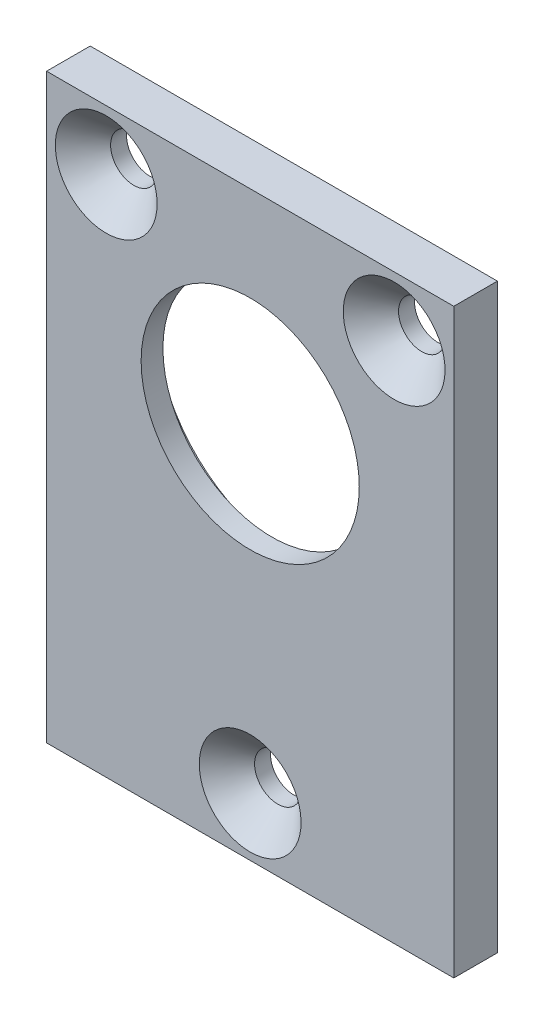
ISO-10303-21;
HEADER;
FILE_DESCRIPTION(('STEP AP214'),'2;1');
FILE_NAME('part.step','',(''),(''),'','','');
FILE_SCHEMA(('AUTOMOTIVE_DESIGN { 1 0 10303 214 1 1 1 1 }'));
ENDSEC;
DATA;
#1=APPLICATION_CONTEXT('core data for automotive mechanical design processes');
#2=APPLICATION_PROTOCOL_DEFINITION('international standard','automotive_design',2000,#1);
#3=PRODUCT_CONTEXT('',#1,'mechanical');
#4=PRODUCT('Part','Part','',(#3));
#5=PRODUCT_RELATED_PRODUCT_CATEGORY('part','',(#4));
#6=PRODUCT_DEFINITION_FORMATION('','',#4);
#7=PRODUCT_DEFINITION_CONTEXT('part definition',#1,'design');
#8=PRODUCT_DEFINITION('design','',#6,#7);
#9=PRODUCT_DEFINITION_SHAPE('','',#8);
#10=(LENGTH_UNIT() NAMED_UNIT(*) SI_UNIT(.MILLI.,.METRE.));
#11=(NAMED_UNIT(*) PLANE_ANGLE_UNIT() SI_UNIT($,.RADIAN.));
#12=(NAMED_UNIT(*) SI_UNIT($,.STERADIAN.) SOLID_ANGLE_UNIT());
#13=UNCERTAINTY_MEASURE_WITH_UNIT(LENGTH_MEASURE(1.E-05),#10,'distance_accuracy_value','');
#14=(GEOMETRIC_REPRESENTATION_CONTEXT(3) GLOBAL_UNCERTAINTY_ASSIGNED_CONTEXT((#13)) GLOBAL_UNIT_ASSIGNED_CONTEXT((#10,
#11,#12)) REPRESENTATION_CONTEXT('',''));
#15=CARTESIAN_POINT('',(0.,0.,0.));
#16=DIRECTION('',(0.,0.,1.));
#17=DIRECTION('',(1.,0.,0.));
#18=AXIS2_PLACEMENT_3D('',#15,#16,#17);
#19=CARTESIAN_POINT('',(0.,0.,0.));
#20=DIRECTION('',(0.,0.,1.));
#21=DIRECTION('',(1.,0.,0.));
#22=AXIS2_PLACEMENT_3D('',#19,#20,#21);
#23=CYLINDRICAL_SURFACE('',#22,9.5);
#24=CARTESIAN_POINT('',(0.,0.,0.));
#25=DIRECTION('',(0.,0.,1.));
#26=DIRECTION('',(1.,0.,0.));
#27=AXIS2_PLACEMENT_3D('',#24,#25,#26);
#28=CIRCLE('',#27,9.5);
#29=CARTESIAN_POINT('',(9.5,0.,0.));
#30=VERTEX_POINT('',#29);
#31=EDGE_CURVE('E20',#30,#30,#28,.F.);
#32=ORIENTED_EDGE('',*,*,#31,.T.);
#33=EDGE_LOOP('',(#32));
#34=FACE_BOUND('',#33,.T.);
#35=CARTESIAN_POINT('',(0.,0.,1.5));
#36=DIRECTION('',(0.,0.,1.));
#37=DIRECTION('',(1.,0.,0.));
#38=AXIS2_PLACEMENT_3D('',#35,#36,#37);
#39=CIRCLE('',#38,9.5);
#40=CARTESIAN_POINT('',(9.5,0.,1.5));
#41=VERTEX_POINT('',#40);
#42=EDGE_CURVE('E69',#41,#41,#39,.T.);
#43=ORIENTED_EDGE('',*,*,#42,.T.);
#44=EDGE_LOOP('',(#43));
#45=FACE_BOUND('',#44,.T.);
#46=ADVANCED_FACE('F17',(#34,#45),#23,.F.);
#47=CARTESIAN_POINT('',(0.,-6.,0.));
#48=DIRECTION('',(0.,0.,1.));
#49=DIRECTION('',(1.,0.,0.));
#50=AXIS2_PLACEMENT_3D('',#47,#48,#49);
#51=PLANE('',#50);
#52=ORIENTED_EDGE('',*,*,#31,.F.);
#53=EDGE_LOOP('',(#52));
#54=FACE_BOUND('',#53,.T.);
#55=CARTESIAN_POINT('',(-9.89949493661167,9.89949493661166,0.));
#56=DIRECTION('',(0.,0.,1.));
#57=DIRECTION('',(1.,0.,0.));
#58=AXIS2_PLACEMENT_3D('',#55,#56,#57);
#59=CIRCLE('',#58,1.6);
#60=CARTESIAN_POINT('',(-8.29949493661167,9.89949493661166,0.));
#61=VERTEX_POINT('',#60);
#62=EDGE_CURVE('E99',#61,#61,#59,.T.);
#63=ORIENTED_EDGE('',*,*,#62,.T.);
#64=EDGE_LOOP('',(#63));
#65=FACE_BOUND('',#64,.T.);
#66=CARTESIAN_POINT('',(0.,-22.,0.));
#67=DIRECTION('',(0.,0.,1.));
#68=DIRECTION('',(1.,0.,0.));
#69=AXIS2_PLACEMENT_3D('',#66,#67,#68);
#70=CIRCLE('',#69,1.6);
#71=CARTESIAN_POINT('',(1.6,-22.,0.));
#72=VERTEX_POINT('',#71);
#73=EDGE_CURVE('E102',#72,#72,#70,.T.);
#74=ORIENTED_EDGE('',*,*,#73,.T.);
#75=EDGE_LOOP('',(#74));
#76=FACE_BOUND('',#75,.T.);
#77=CARTESIAN_POINT('',(9.89949493661167,9.89949493661167,0.));
#78=DIRECTION('',(0.,0.,1.));
#79=DIRECTION('',(1.,0.,0.));
#80=AXIS2_PLACEMENT_3D('',#77,#78,#79);
#81=CIRCLE('',#80,1.6);
#82=CARTESIAN_POINT('',(11.4994949366117,9.89949493661167,0.));
#83=VERTEX_POINT('',#82);
#84=EDGE_CURVE('E104',#83,#83,#81,.T.);
#85=ORIENTED_EDGE('',*,*,#84,.T.);
#86=EDGE_LOOP('',(#85));
#87=FACE_BOUND('',#86,.T.);
#88=DIRECTION('',(0.,1.,0.));
#89=VECTOR('',#88,1.);
#90=CARTESIAN_POINT('',(14.,14.,0.));
#91=LINE('',#90,#89);
#92=CARTESIAN_POINT('',(14.,-26.,0.));
#93=VERTEX_POINT('',#92);
#94=CARTESIAN_POINT('',(14.,14.,0.));
#95=VERTEX_POINT('',#94);
#96=EDGE_CURVE('E60',#93,#95,#91,.T.);
#97=ORIENTED_EDGE('',*,*,#96,.F.);
#98=DIRECTION('',(1.,0.,0.));
#99=VECTOR('',#98,1.);
#100=CARTESIAN_POINT('',(14.,-26.,0.));
#101=LINE('',#100,#99);
#102=CARTESIAN_POINT('',(-14.,-26.,0.));
#103=VERTEX_POINT('',#102);
#104=EDGE_CURVE('E272',#103,#93,#101,.T.);
#105=ORIENTED_EDGE('',*,*,#104,.F.);
#106=DIRECTION('',(0.,1.,0.));
#107=VECTOR('',#106,1.);
#108=CARTESIAN_POINT('',(-14.,-26.,0.));
#109=LINE('',#108,#107);
#110=CARTESIAN_POINT('',(-14.,14.,0.));
#111=VERTEX_POINT('',#110);
#112=EDGE_CURVE('E72',#111,#103,#109,.F.);
#113=ORIENTED_EDGE('',*,*,#112,.F.);
#114=DIRECTION('',(1.,0.,0.));
#115=VECTOR('',#114,1.);
#116=CARTESIAN_POINT('',(-14.,14.,0.));
#117=LINE('',#116,#115);
#118=EDGE_CURVE('E55',#95,#111,#117,.F.);
#119=ORIENTED_EDGE('',*,*,#118,.F.);
#120=EDGE_LOOP('',(#97,#105,#113,#119));
#121=FACE_BOUND('',#120,.T.);
#122=ADVANCED_FACE('F71',(#54,#65,#76,#87,#121),#51,.F.);
#123=CARTESIAN_POINT('',(9.89949493661167,9.89949493661167,-45.91829923454));
#124=DIRECTION('',(0.,0.,1.));
#125=DIRECTION('',(1.,0.,0.));
#126=AXIS2_PLACEMENT_3D('',#123,#124,#125);
#127=CYLINDRICAL_SURFACE('',#126,1.6);
#128=CARTESIAN_POINT('',(9.89949493661167,9.89949493661167,1.0999999990986));
#129=DIRECTION('',(0.,0.,1.));
#130=DIRECTION('',(1.,0.,0.));
#131=AXIS2_PLACEMENT_3D('',#128,#129,#130);
#132=CIRCLE('',#131,1.60000000092699);
#133=CARTESIAN_POINT('',(11.4994949375387,9.89949493661167,1.0999999990986));
#134=VERTEX_POINT('',#133);
#135=EDGE_CURVE('E279',#134,#134,#132,.T.);
#136=ORIENTED_EDGE('',*,*,#135,.T.);
#137=EDGE_LOOP('',(#136));
#138=FACE_BOUND('',#137,.T.);
#139=ORIENTED_EDGE('',*,*,#84,.F.);
#140=EDGE_LOOP('',(#139));
#141=FACE_BOUND('',#140,.T.);
#142=ADVANCED_FACE('F115',(#138,#141),#127,.F.);
#143=CARTESIAN_POINT('',(0.,-22.,-45.91829923454));
#144=DIRECTION('',(0.,0.,1.));
#145=DIRECTION('',(1.,0.,0.));
#146=AXIS2_PLACEMENT_3D('',#143,#144,#145);
#147=CYLINDRICAL_SURFACE('',#146,1.6);
#148=CARTESIAN_POINT('',(0.,-22.,1.09999999921229));
#149=DIRECTION('',(0.,0.,1.));
#150=DIRECTION('',(1.,0.,0.));
#151=AXIS2_PLACEMENT_3D('',#148,#149,#150);
#152=CIRCLE('',#151,1.60000000084892);
#153=CARTESIAN_POINT('',(1.60000000084892,-22.,1.09999999921229));
#154=VERTEX_POINT('',#153);
#155=EDGE_CURVE('E284',#154,#154,#152,.T.);
#156=ORIENTED_EDGE('',*,*,#155,.T.);
#157=EDGE_LOOP('',(#156));
#158=FACE_BOUND('',#157,.T.);
#159=ORIENTED_EDGE('',*,*,#73,.F.);
#160=EDGE_LOOP('',(#159));
#161=FACE_BOUND('',#160,.T.);
#162=ADVANCED_FACE('F120',(#158,#161),#147,.F.);
#163=CARTESIAN_POINT('',(-9.89949493661167,9.89949493661166,-45.91829923454));
#164=DIRECTION('',(0.,0.,1.));
#165=DIRECTION('',(1.,0.,0.));
#166=AXIS2_PLACEMENT_3D('',#163,#164,#165);
#167=CYLINDRICAL_SURFACE('',#166,1.6);
#168=CARTESIAN_POINT('',(-9.89949493661167,9.89949493661166,1.09999999915544));
#169=DIRECTION('',(0.,0.,1.));
#170=DIRECTION('',(1.,0.,0.));
#171=AXIS2_PLACEMENT_3D('',#168,#169,#170);
#172=CIRCLE('',#171,1.60000000094138);
#173=CARTESIAN_POINT('',(-8.29949493567028,9.89949493661166,1.09999999915544));
#174=VERTEX_POINT('',#173);
#175=EDGE_CURVE('E96',#174,#174,#172,.T.);
#176=ORIENTED_EDGE('',*,*,#175,.T.);
#177=EDGE_LOOP('',(#176));
#178=FACE_BOUND('',#177,.T.);
#179=ORIENTED_EDGE('',*,*,#62,.F.);
#180=EDGE_LOOP('',(#179));
#181=FACE_BOUND('',#180,.T.);
#182=ADVANCED_FACE('F122',(#178,#181),#167,.F.);
#183=CARTESIAN_POINT('',(0.,0.,1.5));
#184=DIRECTION('',(0.,0.,1.));
#185=DIRECTION('',(1.,0.,0.));
#186=AXIS2_PLACEMENT_3D('',#183,#184,#185);
#187=PLANE('',#186);
#188=CARTESIAN_POINT('',(0.,0.,1.5));
#189=DIRECTION('',(0.,0.,1.));
#190=DIRECTION('',(1.,0.,0.));
#191=AXIS2_PLACEMENT_3D('',#188,#189,#190);
#192=CIRCLE('',#191,7.5);
#193=CARTESIAN_POINT('',(7.5,0.,1.5));
#194=VERTEX_POINT('',#193);
#195=EDGE_CURVE('E92',#194,#194,#192,.T.);
#196=ORIENTED_EDGE('',*,*,#195,.T.);
#197=EDGE_LOOP('',(#196));
#198=FACE_BOUND('',#197,.T.);
#199=ORIENTED_EDGE('',*,*,#42,.F.);
#200=EDGE_LOOP('',(#199));
#201=FACE_BOUND('',#200,.T.);
#202=ADVANCED_FACE('F130',(#198,#201),#187,.F.);
#203=CARTESIAN_POINT('',(14.,14.,0.));
#204=DIRECTION('',(1.,0.,0.));
#205=DIRECTION('',(0.,0.,-1.));
#206=AXIS2_PLACEMENT_3D('',#203,#204,#205);
#207=PLANE('',#206);
#208=ORIENTED_EDGE('',*,*,#96,.T.);
#209=DIRECTION('',(0.,0.,1.));
#210=VECTOR('',#209,1.);
#211=CARTESIAN_POINT('',(14.,14.,0.));
#212=LINE('',#211,#210);
#213=CARTESIAN_POINT('',(14.,14.,3.));
#214=VERTEX_POINT('',#213);
#215=EDGE_CURVE('E62',#214,#95,#212,.F.);
#216=ORIENTED_EDGE('',*,*,#215,.F.);
#217=DIRECTION('',(0.,1.,0.));
#218=VECTOR('',#217,1.);
#219=CARTESIAN_POINT('',(14.,-6.,3.));
#220=LINE('',#219,#218);
#221=CARTESIAN_POINT('',(14.,-26.,3.));
#222=VERTEX_POINT('',#221);
#223=EDGE_CURVE('E95',#222,#214,#220,.T.);
#224=ORIENTED_EDGE('',*,*,#223,.F.);
#225=DIRECTION('',(0.,0.,-1.));
#226=VECTOR('',#225,1.);
#227=CARTESIAN_POINT('',(14.,-26.,0.));
#228=LINE('',#227,#226);
#229=EDGE_CURVE('E65',#93,#222,#228,.F.);
#230=ORIENTED_EDGE('',*,*,#229,.F.);
#231=EDGE_LOOP('',(#208,#216,#224,#230));
#232=FACE_BOUND('',#231,.T.);
#233=ADVANCED_FACE('F61',(#232),#207,.T.);
#234=CARTESIAN_POINT('',(-14.,14.,0.));
#235=DIRECTION('',(0.,1.,0.));
#236=DIRECTION('',(0.,0.,1.));
#237=AXIS2_PLACEMENT_3D('',#234,#235,#236);
#238=PLANE('',#237);
#239=ORIENTED_EDGE('',*,*,#118,.T.);
#240=DIRECTION('',(0.,0.,1.));
#241=VECTOR('',#240,1.);
#242=CARTESIAN_POINT('',(-14.,14.,0.));
#243=LINE('',#242,#241);
#244=CARTESIAN_POINT('',(-14.,14.,3.));
#245=VERTEX_POINT('',#244);
#246=EDGE_CURVE('E74',#245,#111,#243,.F.);
#247=ORIENTED_EDGE('',*,*,#246,.F.);
#248=DIRECTION('',(1.,0.,0.));
#249=VECTOR('',#248,1.);
#250=CARTESIAN_POINT('',(0.,14.,3.));
#251=LINE('',#250,#249);
#252=EDGE_CURVE('E78',#214,#245,#251,.F.);
#253=ORIENTED_EDGE('',*,*,#252,.F.);
#254=ORIENTED_EDGE('',*,*,#215,.T.);
#255=EDGE_LOOP('',(#239,#247,#253,#254));
#256=FACE_BOUND('',#255,.T.);
#257=ADVANCED_FACE('F76',(#256),#238,.T.);
#258=CARTESIAN_POINT('',(-14.,-26.,0.));
#259=DIRECTION('',(-1.,0.,0.));
#260=DIRECTION('',(0.,0.,1.));
#261=AXIS2_PLACEMENT_3D('',#258,#259,#260);
#262=PLANE('',#261);
#263=ORIENTED_EDGE('',*,*,#112,.T.);
#264=DIRECTION('',(0.,0.,-1.));
#265=VECTOR('',#264,1.);
#266=CARTESIAN_POINT('',(-14.,-26.,0.));
#267=LINE('',#266,#265);
#268=CARTESIAN_POINT('',(-14.,-26.,3.));
#269=VERTEX_POINT('',#268);
#270=EDGE_CURVE('E35',#269,#103,#267,.T.);
#271=ORIENTED_EDGE('',*,*,#270,.F.);
#272=DIRECTION('',(0.,1.,0.));
#273=VECTOR('',#272,1.);
#274=CARTESIAN_POINT('',(-14.,-6.,3.));
#275=LINE('',#274,#273);
#276=EDGE_CURVE('E294',#245,#269,#275,.F.);
#277=ORIENTED_EDGE('',*,*,#276,.F.);
#278=ORIENTED_EDGE('',*,*,#246,.T.);
#279=EDGE_LOOP('',(#263,#271,#277,#278));
#280=FACE_BOUND('',#279,.T.);
#281=ADVANCED_FACE('F163',(#280),#262,.T.);
#282=CARTESIAN_POINT('',(14.,-26.,0.));
#283=DIRECTION('',(0.,-1.,0.));
#284=DIRECTION('',(0.,0.,-1.));
#285=AXIS2_PLACEMENT_3D('',#282,#283,#284);
#286=PLANE('',#285);
#287=ORIENTED_EDGE('',*,*,#104,.T.);
#288=ORIENTED_EDGE('',*,*,#229,.T.);
#289=DIRECTION('',(1.,0.,0.));
#290=VECTOR('',#289,1.);
#291=CARTESIAN_POINT('',(0.,-26.,3.));
#292=LINE('',#291,#290);
#293=EDGE_CURVE('E91',#269,#222,#292,.T.);
#294=ORIENTED_EDGE('',*,*,#293,.F.);
#295=ORIENTED_EDGE('',*,*,#270,.T.);
#296=EDGE_LOOP('',(#287,#288,#294,#295));
#297=FACE_BOUND('',#296,.T.);
#298=ADVANCED_FACE('F159',(#297),#286,.T.);
#299=CARTESIAN_POINT('',(9.89949493661167,9.89949493661167,3.00000000078171));
#300=DIRECTION('',(0.,0.,1.));
#301=DIRECTION('',(1.,0.,0.));
#302=AXIS2_PLACEMENT_3D('',#299,#300,#301);
#303=CONICAL_SURFACE('',#302,3.4999999991995,0.785398162499921);
#304=ORIENTED_EDGE('',*,*,#135,.F.);
#305=EDGE_LOOP('',(#304));
#306=FACE_BOUND('',#305,.T.);
#307=CARTESIAN_POINT('',(9.89949493661167,9.89949493661167,3.00000000078171));
#308=DIRECTION('',(0.,0.,1.));
#309=DIRECTION('',(1.,0.,0.));
#310=AXIS2_PLACEMENT_3D('',#307,#308,#309);
#311=CIRCLE('',#310,3.4999999991995);
#312=CARTESIAN_POINT('',(13.3994949358112,9.89949493661167,3.00000000078171));
#313=VERTEX_POINT('',#312);
#314=EDGE_CURVE('E88',#313,#313,#311,.F.);
#315=ORIENTED_EDGE('',*,*,#314,.F.);
#316=EDGE_LOOP('',(#315));
#317=FACE_BOUND('',#316,.T.);
#318=ADVANCED_FACE('F155',(#306,#317),#303,.F.);
#319=CARTESIAN_POINT('',(0.,-22.,3.0000000008954));
#320=DIRECTION('',(0.,0.,1.));
#321=DIRECTION('',(0.,-1.,0.));
#322=AXIS2_PLACEMENT_3D('',#319,#320,#321);
#323=CONICAL_SURFACE('',#322,3.49999999917827,0.785398162514879);
#324=ORIENTED_EDGE('',*,*,#155,.F.);
#325=EDGE_LOOP('',(#324));
#326=FACE_BOUND('',#325,.T.);
#327=CARTESIAN_POINT('',(0.,-22.,3.0000000008954));
#328=DIRECTION('',(0.,0.,1.));
#329=DIRECTION('',(0.,-1.,0.));
#330=AXIS2_PLACEMENT_3D('',#327,#328,#329);
#331=CIRCLE('',#330,3.49999999917827);
#332=CARTESIAN_POINT('',(0.,-25.4999999991783,3.0000000008954));
#333=VERTEX_POINT('',#332);
#334=EDGE_CURVE('E85',#333,#333,#331,.F.);
#335=ORIENTED_EDGE('',*,*,#334,.F.);
#336=EDGE_LOOP('',(#335));
#337=FACE_BOUND('',#336,.T.);
#338=ADVANCED_FACE('F151',(#326,#337),#323,.F.);
#339=CARTESIAN_POINT('',(-9.89949493661167,9.89949493661166,3.00000000083855));
#340=DIRECTION('',(0.,0.,1.));
#341=DIRECTION('',(1.,0.,0.));
#342=AXIS2_PLACEMENT_3D('',#339,#340,#341);
#343=CONICAL_SURFACE('',#342,3.49999999921389,0.785398162499921);
#344=ORIENTED_EDGE('',*,*,#175,.F.);
#345=EDGE_LOOP('',(#344));
#346=FACE_BOUND('',#345,.T.);
#347=CARTESIAN_POINT('',(-9.89949493661167,9.89949493661166,3.00000000083855));
#348=DIRECTION('',(0.,0.,1.));
#349=DIRECTION('',(1.,0.,0.));
#350=AXIS2_PLACEMENT_3D('',#347,#348,#349);
#351=CIRCLE('',#350,3.49999999921389);
#352=CARTESIAN_POINT('',(-6.39949493739778,9.89949493661166,3.00000000083855));
#353=VERTEX_POINT('',#352);
#354=EDGE_CURVE('E26',#353,#353,#351,.F.);
#355=ORIENTED_EDGE('',*,*,#354,.F.);
#356=EDGE_LOOP('',(#355));
#357=FACE_BOUND('',#356,.T.);
#358=ADVANCED_FACE('F144',(#346,#357),#343,.F.);
#359=CARTESIAN_POINT('',(0.,0.,0.));
#360=DIRECTION('',(0.,0.,1.));
#361=DIRECTION('',(1.,0.,0.));
#362=AXIS2_PLACEMENT_3D('',#359,#360,#361);
#363=CYLINDRICAL_SURFACE('',#362,7.5);
#364=CARTESIAN_POINT('',(0.,0.,3.));
#365=DIRECTION('',(0.,0.,1.));
#366=DIRECTION('',(1.,0.,0.));
#367=AXIS2_PLACEMENT_3D('',#364,#365,#366);
#368=CIRCLE('',#367,7.5);
#369=CARTESIAN_POINT('',(7.5,0.,3.));
#370=VERTEX_POINT('',#369);
#371=EDGE_CURVE('E11',#370,#370,#368,.F.);
#372=ORIENTED_EDGE('',*,*,#371,.F.);
#373=EDGE_LOOP('',(#372));
#374=FACE_BOUND('',#373,.T.);
#375=ORIENTED_EDGE('',*,*,#195,.F.);
#376=EDGE_LOOP('',(#375));
#377=FACE_BOUND('',#376,.T.);
#378=ADVANCED_FACE('F138',(#374,#377),#363,.F.);
#379=CARTESIAN_POINT('',(0.,-6.,3.));
#380=DIRECTION('',(0.,0.,1.));
#381=DIRECTION('',(1.,0.,0.));
#382=AXIS2_PLACEMENT_3D('',#379,#380,#381);
#383=PLANE('',#382);
#384=ORIENTED_EDGE('',*,*,#371,.T.);
#385=EDGE_LOOP('',(#384));
#386=FACE_BOUND('',#385,.T.);
#387=ORIENTED_EDGE('',*,*,#354,.T.);
#388=EDGE_LOOP('',(#387));
#389=FACE_BOUND('',#388,.T.);
#390=ORIENTED_EDGE('',*,*,#334,.T.);
#391=EDGE_LOOP('',(#390));
#392=FACE_BOUND('',#391,.T.);
#393=ORIENTED_EDGE('',*,*,#314,.T.);
#394=EDGE_LOOP('',(#393));
#395=FACE_BOUND('',#394,.T.);
#396=ORIENTED_EDGE('',*,*,#276,.T.);
#397=ORIENTED_EDGE('',*,*,#293,.T.);
#398=ORIENTED_EDGE('',*,*,#223,.T.);
#399=ORIENTED_EDGE('',*,*,#252,.T.);
#400=EDGE_LOOP('',(#396,#397,#398,#399));
#401=FACE_BOUND('',#400,.T.);
#402=ADVANCED_FACE('F136',(#386,#389,#392,#395,#401),#383,.T.);
#403=CLOSED_SHELL('',(#46,#122,#142,#162,#182,#202,#233,#257,#281,#298,#318,#338,#358,#378,#402));
#404=MANIFOLD_SOLID_BREP('B1',#403);
#405=ADVANCED_BREP_SHAPE_REPRESENTATION('',(#18,#404),#14);
#406=SHAPE_DEFINITION_REPRESENTATION(#9,#405);
ENDSEC;
END-ISO-10303-21;
